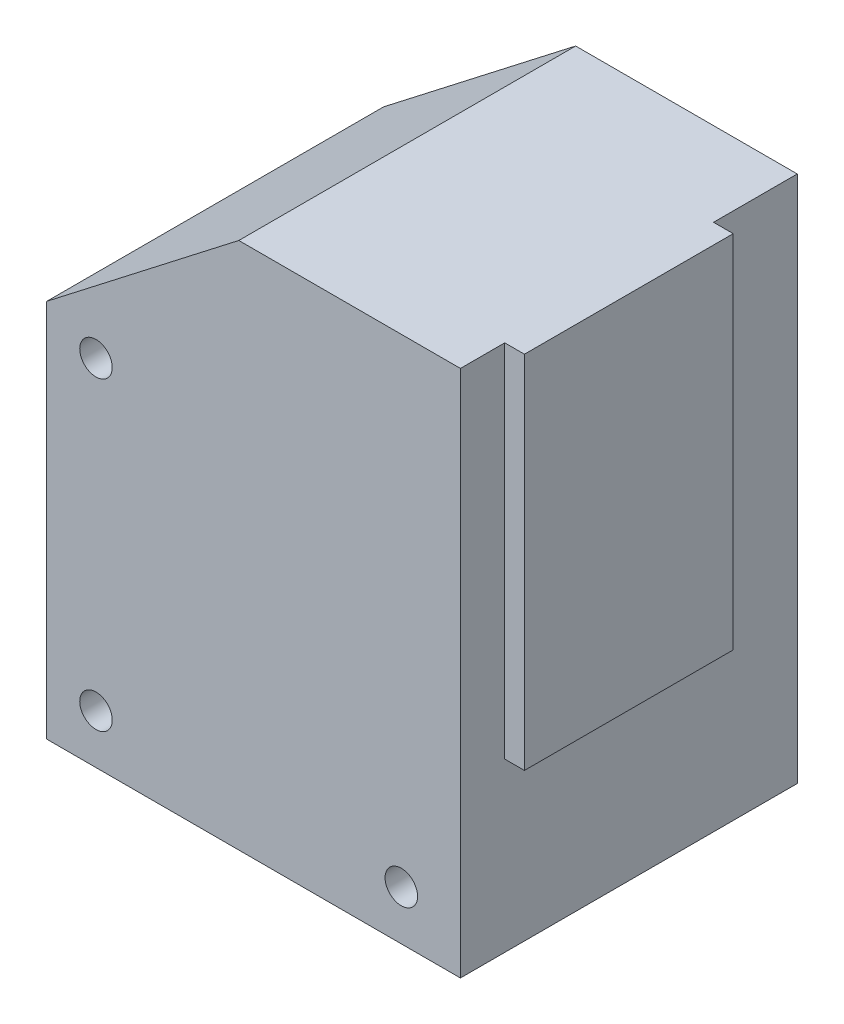
ISO-10303-21;
HEADER;
FILE_DESCRIPTION(('STEP AP214'),'2;1');
FILE_NAME('part.step','',(''),(''),'','','');
FILE_SCHEMA(('AUTOMOTIVE_DESIGN { 1 0 10303 214 1 1 1 1 }'));
ENDSEC;
DATA;
#1=APPLICATION_CONTEXT('core data for automotive mechanical design processes');
#2=APPLICATION_PROTOCOL_DEFINITION('international standard','automotive_design',2000,#1);
#3=PRODUCT_CONTEXT('',#1,'mechanical');
#4=PRODUCT('Part','Part','',(#3));
#5=PRODUCT_RELATED_PRODUCT_CATEGORY('part','',(#4));
#6=PRODUCT_DEFINITION_FORMATION('','',#4);
#7=PRODUCT_DEFINITION_CONTEXT('part definition',#1,'design');
#8=PRODUCT_DEFINITION('design','',#6,#7);
#9=PRODUCT_DEFINITION_SHAPE('','',#8);
#10=(LENGTH_UNIT() NAMED_UNIT(*) SI_UNIT(.MILLI.,.METRE.));
#11=(NAMED_UNIT(*) PLANE_ANGLE_UNIT() SI_UNIT($,.RADIAN.));
#12=(NAMED_UNIT(*) SI_UNIT($,.STERADIAN.) SOLID_ANGLE_UNIT());
#13=UNCERTAINTY_MEASURE_WITH_UNIT(LENGTH_MEASURE(1.E-05),#10,'distance_accuracy_value','');
#14=(GEOMETRIC_REPRESENTATION_CONTEXT(3) GLOBAL_UNCERTAINTY_ASSIGNED_CONTEXT((#13)) GLOBAL_UNIT_ASSIGNED_CONTEXT((#10,
#11,#12)) REPRESENTATION_CONTEXT('',''));
#15=CARTESIAN_POINT('',(0.,0.,0.));
#16=DIRECTION('',(0.,0.,1.));
#17=DIRECTION('',(1.,0.,0.));
#18=AXIS2_PLACEMENT_3D('',#15,#16,#17);
#19=CARTESIAN_POINT('',(42.,0.,34.2));
#20=DIRECTION('',(-1.,0.,0.));
#21=DIRECTION('',(0.,0.,1.));
#22=AXIS2_PLACEMENT_3D('',#19,#20,#21);
#23=PLANE('',#22);
#24=DIRECTION('',(0.,-1.,0.));
#25=VECTOR('',#24,1.);
#26=CARTESIAN_POINT('',(42.,53.6,29.7));
#27=LINE('',#26,#25);
#28=CARTESIAN_POINT('',(42.,53.6,29.7));
#29=VERTEX_POINT('',#28);
#30=CARTESIAN_POINT('',(42.,17.,29.7));
#31=VERTEX_POINT('',#30);
#32=EDGE_CURVE('E134',#29,#31,#27,.T.);
#33=ORIENTED_EDGE('',*,*,#32,.F.);
#34=DIRECTION('',(0.,0.,-1.));
#35=VECTOR('',#34,1.);
#36=CARTESIAN_POINT('',(42.,53.6,34.2));
#37=LINE('',#36,#35);
#38=CARTESIAN_POINT('',(42.,53.6,34.2));
#39=VERTEX_POINT('',#38);
#40=EDGE_CURVE('E190',#39,#29,#37,.T.);
#41=ORIENTED_EDGE('',*,*,#40,.F.);
#42=DIRECTION('',(0.,1.,0.));
#43=VECTOR('',#42,1.);
#44=CARTESIAN_POINT('',(42.,0.,34.2));
#45=LINE('',#44,#43);
#46=CARTESIAN_POINT('',(42.,0.,34.2));
#47=VERTEX_POINT('',#46);
#48=EDGE_CURVE('E159',#47,#39,#45,.T.);
#49=ORIENTED_EDGE('',*,*,#48,.F.);
#50=DIRECTION('',(0.,0.,-1.));
#51=VECTOR('',#50,1.);
#52=CARTESIAN_POINT('',(42.,0.,34.2));
#53=LINE('',#52,#51);
#54=CARTESIAN_POINT('',(42.,0.,0.));
#55=VERTEX_POINT('',#54);
#56=EDGE_CURVE('E48',#47,#55,#53,.T.);
#57=ORIENTED_EDGE('',*,*,#56,.T.);
#58=DIRECTION('',(0.,1.,0.));
#59=VECTOR('',#58,1.);
#60=CARTESIAN_POINT('',(42.,0.,0.));
#61=LINE('',#60,#59);
#62=CARTESIAN_POINT('',(42.,53.6,0.));
#63=VERTEX_POINT('',#62);
#64=EDGE_CURVE('E175',#55,#63,#61,.T.);
#65=ORIENTED_EDGE('',*,*,#64,.T.);
#66=CARTESIAN_POINT('',(42.,53.6,8.5));
#67=VERTEX_POINT('',#66);
#68=EDGE_CURVE('E61',#67,#63,#37,.T.);
#69=ORIENTED_EDGE('',*,*,#68,.F.);
#70=DIRECTION('',(0.,1.,0.));
#71=VECTOR('',#70,1.);
#72=CARTESIAN_POINT('',(42.,53.6,8.5));
#73=LINE('',#72,#71);
#74=CARTESIAN_POINT('',(42.,17.,8.5));
#75=VERTEX_POINT('',#74);
#76=EDGE_CURVE('E131',#75,#67,#73,.T.);
#77=ORIENTED_EDGE('',*,*,#76,.F.);
#78=DIRECTION('',(0.,0.,-1.));
#79=VECTOR('',#78,1.);
#80=CARTESIAN_POINT('',(42.,17.,29.7));
#81=LINE('',#80,#79);
#82=EDGE_CURVE('E55',#31,#75,#81,.T.);
#83=ORIENTED_EDGE('',*,*,#82,.F.);
#84=EDGE_LOOP('',(#33,#41,#49,#57,#65,#69,#77,#83));
#85=FACE_BOUND('',#84,.T.);
#86=ADVANCED_FACE('F39',(#85),#23,.F.);
#87=CARTESIAN_POINT('',(0.,0.,34.2));
#88=DIRECTION('',(1.,0.,0.));
#89=DIRECTION('',(0.,0.,-1.));
#90=AXIS2_PLACEMENT_3D('',#87,#88,#89);
#91=PLANE('',#90);
#92=DIRECTION('',(0.,-1.,0.));
#93=VECTOR('',#92,1.);
#94=CARTESIAN_POINT('',(0.,0.,0.));
#95=LINE('',#94,#93);
#96=CARTESIAN_POINT('',(0.,38.5,0.));
#97=VERTEX_POINT('',#96);
#98=CARTESIAN_POINT('',(0.,0.,0.));
#99=VERTEX_POINT('',#98);
#100=EDGE_CURVE('E149',#97,#99,#95,.T.);
#101=ORIENTED_EDGE('',*,*,#100,.T.);
#102=DIRECTION('',(0.,0.,-1.));
#103=VECTOR('',#102,1.);
#104=CARTESIAN_POINT('',(0.,0.,34.2));
#105=LINE('',#104,#103);
#106=CARTESIAN_POINT('',(0.,0.,34.2));
#107=VERTEX_POINT('',#106);
#108=EDGE_CURVE('E11',#107,#99,#105,.T.);
#109=ORIENTED_EDGE('',*,*,#108,.F.);
#110=DIRECTION('',(0.,-1.,0.));
#111=VECTOR('',#110,1.);
#112=CARTESIAN_POINT('',(0.,0.,34.2));
#113=LINE('',#112,#111);
#114=CARTESIAN_POINT('',(0.,38.5,34.2));
#115=VERTEX_POINT('',#114);
#116=EDGE_CURVE('E151',#115,#107,#113,.T.);
#117=ORIENTED_EDGE('',*,*,#116,.F.);
#118=DIRECTION('',(0.,0.,-1.));
#119=VECTOR('',#118,1.);
#120=CARTESIAN_POINT('',(0.,38.5,34.2));
#121=LINE('',#120,#119);
#122=EDGE_CURVE('E168',#115,#97,#121,.T.);
#123=ORIENTED_EDGE('',*,*,#122,.T.);
#124=EDGE_LOOP('',(#101,#109,#117,#123));
#125=FACE_BOUND('',#124,.T.);
#126=ADVANCED_FACE('F41',(#125),#91,.F.);
#127=CARTESIAN_POINT('',(0.,0.,34.2));
#128=DIRECTION('',(0.,1.,0.));
#129=DIRECTION('',(0.,0.,1.));
#130=AXIS2_PLACEMENT_3D('',#127,#128,#129);
#131=PLANE('',#130);
#132=CARTESIAN_POINT('',(26.,0.,23.7));
#133=DIRECTION('',(0.,-1.,0.));
#134=DIRECTION('',(0.,0.,-1.));
#135=AXIS2_PLACEMENT_3D('',#132,#133,#134);
#136=CIRCLE('',#135,8.);
#137=CARTESIAN_POINT('',(26.,0.,15.7));
#138=VERTEX_POINT('',#137);
#139=EDGE_CURVE('E136',#138,#138,#136,.T.);
#140=ORIENTED_EDGE('',*,*,#139,.F.);
#141=EDGE_LOOP('',(#140));
#142=FACE_BOUND('',#141,.T.);
#143=DIRECTION('',(1.,0.,0.));
#144=VECTOR('',#143,1.);
#145=CARTESIAN_POINT('',(0.,0.,0.));
#146=LINE('',#145,#144);
#147=EDGE_CURVE('E172',#99,#55,#146,.T.);
#148=ORIENTED_EDGE('',*,*,#147,.T.);
#149=ORIENTED_EDGE('',*,*,#56,.F.);
#150=DIRECTION('',(1.,0.,0.));
#151=VECTOR('',#150,1.);
#152=CARTESIAN_POINT('',(0.,0.,34.2));
#153=LINE('',#152,#151);
#154=EDGE_CURVE('E155',#107,#47,#153,.T.);
#155=ORIENTED_EDGE('',*,*,#154,.F.);
#156=ORIENTED_EDGE('',*,*,#108,.T.);
#157=EDGE_LOOP('',(#148,#149,#155,#156));
#158=FACE_BOUND('',#157,.T.);
#159=ADVANCED_FACE('F293',(#142,#158),#131,.F.);
#160=CARTESIAN_POINT('',(19.5,53.6,34.2));
#161=DIRECTION('',(0.,-1.,0.));
#162=DIRECTION('',(0.,0.,-1.));
#163=AXIS2_PLACEMENT_3D('',#160,#161,#162);
#164=PLANE('',#163);
#165=DIRECTION('',(-1.,0.,0.));
#166=VECTOR('',#165,1.);
#167=CARTESIAN_POINT('',(19.5,53.6,0.));
#168=LINE('',#167,#166);
#169=CARTESIAN_POINT('',(19.5,53.6,0.));
#170=VERTEX_POINT('',#169);
#171=EDGE_CURVE('E178',#63,#170,#168,.T.);
#172=ORIENTED_EDGE('',*,*,#171,.T.);
#173=DIRECTION('',(0.,0.,-1.));
#174=VECTOR('',#173,1.);
#175=CARTESIAN_POINT('',(19.5,53.6,34.2));
#176=LINE('',#175,#174);
#177=CARTESIAN_POINT('',(19.5,53.6,34.2));
#178=VERTEX_POINT('',#177);
#179=EDGE_CURVE('E186',#178,#170,#176,.T.);
#180=ORIENTED_EDGE('',*,*,#179,.F.);
#181=DIRECTION('',(-1.,0.,0.));
#182=VECTOR('',#181,1.);
#183=CARTESIAN_POINT('',(19.5,53.6,34.2));
#184=LINE('',#183,#182);
#185=EDGE_CURVE('E162',#39,#178,#184,.T.);
#186=ORIENTED_EDGE('',*,*,#185,.F.);
#187=ORIENTED_EDGE('',*,*,#40,.T.);
#188=DIRECTION('',(-1.,0.,0.));
#189=VECTOR('',#188,1.);
#190=CARTESIAN_POINT('',(44.,53.6,29.7));
#191=LINE('',#190,#189);
#192=CARTESIAN_POINT('',(44.,53.6,29.7));
#193=VERTEX_POINT('',#192);
#194=EDGE_CURVE('E218',#193,#29,#191,.T.);
#195=ORIENTED_EDGE('',*,*,#194,.F.);
#196=DIRECTION('',(0.,0.,1.));
#197=VECTOR('',#196,1.);
#198=CARTESIAN_POINT('',(44.,53.6,29.7));
#199=LINE('',#198,#197);
#200=CARTESIAN_POINT('',(44.,53.6,8.5));
#201=VERTEX_POINT('',#200);
#202=EDGE_CURVE('E126',#201,#193,#199,.T.);
#203=ORIENTED_EDGE('',*,*,#202,.F.);
#204=DIRECTION('',(-1.,0.,0.));
#205=VECTOR('',#204,1.);
#206=CARTESIAN_POINT('',(44.,53.6,8.5));
#207=LINE('',#206,#205);
#208=EDGE_CURVE('E143',#201,#67,#207,.T.);
#209=ORIENTED_EDGE('',*,*,#208,.T.);
#210=ORIENTED_EDGE('',*,*,#68,.T.);
#211=EDGE_LOOP('',(#172,#180,#186,#187,#195,#203,#209,#210));
#212=FACE_BOUND('',#211,.T.);
#213=ADVANCED_FACE('F207',(#212),#164,.F.);
#214=CARTESIAN_POINT('',(0.,38.5,34.2));
#215=DIRECTION('',(0.612254968981374,-0.79066039040641,0.));
#216=DIRECTION('',(0.79066039040641,0.612254968981374,0.));
#217=AXIS2_PLACEMENT_3D('',#214,#215,#216);
#218=PLANE('',#217);
#219=DIRECTION('',(-0.79066039040641,-0.612254968981374,0.));
#220=VECTOR('',#219,1.);
#221=CARTESIAN_POINT('',(0.,38.5,0.));
#222=LINE('',#221,#220);
#223=EDGE_CURVE('E156',#170,#97,#222,.T.);
#224=ORIENTED_EDGE('',*,*,#223,.T.);
#225=ORIENTED_EDGE('',*,*,#122,.F.);
#226=DIRECTION('',(-0.79066039040641,-0.612254968981374,0.));
#227=VECTOR('',#226,1.);
#228=CARTESIAN_POINT('',(0.,38.5,34.2));
#229=LINE('',#228,#227);
#230=EDGE_CURVE('E165',#178,#115,#229,.T.);
#231=ORIENTED_EDGE('',*,*,#230,.F.);
#232=ORIENTED_EDGE('',*,*,#179,.T.);
#233=EDGE_LOOP('',(#224,#225,#231,#232));
#234=FACE_BOUND('',#233,.T.);
#235=ADVANCED_FACE('F212',(#234),#218,.F.);
#236=CARTESIAN_POINT('',(0.,0.,34.2));
#237=DIRECTION('',(0.,0.,-1.));
#238=DIRECTION('',(-1.,0.,0.));
#239=AXIS2_PLACEMENT_3D('',#236,#237,#238);
#240=PLANE('',#239);
#241=CARTESIAN_POINT('',(36.,5.,34.2));
#242=DIRECTION('',(0.,0.,-1.));
#243=DIRECTION('',(-1.,0.,0.));
#244=AXIS2_PLACEMENT_3D('',#241,#242,#243);
#245=CIRCLE('',#244,1.65);
#246=CARTESIAN_POINT('',(34.35,5.,34.2));
#247=VERTEX_POINT('',#246);
#248=EDGE_CURVE('E230',#247,#247,#245,.T.);
#249=ORIENTED_EDGE('',*,*,#248,.T.);
#250=EDGE_LOOP('',(#249));
#251=FACE_BOUND('',#250,.T.);
#252=CARTESIAN_POINT('',(5.,5.,34.2));
#253=DIRECTION('',(0.,0.,-1.));
#254=DIRECTION('',(-1.,0.,0.));
#255=AXIS2_PLACEMENT_3D('',#252,#253,#254);
#256=CIRCLE('',#255,1.65);
#257=CARTESIAN_POINT('',(3.35,5.,34.2));
#258=VERTEX_POINT('',#257);
#259=EDGE_CURVE('E246',#258,#258,#256,.T.);
#260=ORIENTED_EDGE('',*,*,#259,.T.);
#261=EDGE_LOOP('',(#260));
#262=FACE_BOUND('',#261,.T.);
#263=CARTESIAN_POINT('',(5.,36.,34.2));
#264=DIRECTION('',(0.,0.,-1.));
#265=DIRECTION('',(-1.,0.,0.));
#266=AXIS2_PLACEMENT_3D('',#263,#264,#265);
#267=CIRCLE('',#266,1.65);
#268=CARTESIAN_POINT('',(3.35,36.,34.2));
#269=VERTEX_POINT('',#268);
#270=EDGE_CURVE('E238',#269,#269,#267,.T.);
#271=ORIENTED_EDGE('',*,*,#270,.T.);
#272=EDGE_LOOP('',(#271));
#273=FACE_BOUND('',#272,.T.);
#274=ORIENTED_EDGE('',*,*,#116,.T.);
#275=ORIENTED_EDGE('',*,*,#154,.T.);
#276=ORIENTED_EDGE('',*,*,#48,.T.);
#277=ORIENTED_EDGE('',*,*,#185,.T.);
#278=ORIENTED_EDGE('',*,*,#230,.T.);
#279=EDGE_LOOP('',(#274,#275,#276,#277,#278));
#280=FACE_BOUND('',#279,.T.);
#281=ADVANCED_FACE('F216',(#251,#262,#273,#280),#240,.F.);
#282=CARTESIAN_POINT('',(0.,0.,0.));
#283=DIRECTION('',(0.,0.,-1.));
#284=DIRECTION('',(-1.,0.,0.));
#285=AXIS2_PLACEMENT_3D('',#282,#283,#284);
#286=PLANE('',#285);
#287=CARTESIAN_POINT('',(36.,5.,0.));
#288=DIRECTION('',(0.,0.,-1.));
#289=DIRECTION('',(-1.,0.,0.));
#290=AXIS2_PLACEMENT_3D('',#287,#288,#289);
#291=CIRCLE('',#290,1.65);
#292=CARTESIAN_POINT('',(34.35,5.,0.));
#293=VERTEX_POINT('',#292);
#294=EDGE_CURVE('E250',#293,#293,#291,.T.);
#295=ORIENTED_EDGE('',*,*,#294,.F.);
#296=EDGE_LOOP('',(#295));
#297=FACE_BOUND('',#296,.T.);
#298=CARTESIAN_POINT('',(5.,5.,0.));
#299=DIRECTION('',(0.,0.,-1.));
#300=DIRECTION('',(-1.,0.,0.));
#301=AXIS2_PLACEMENT_3D('',#298,#299,#300);
#302=CIRCLE('',#301,1.65);
#303=CARTESIAN_POINT('',(3.35,5.,0.));
#304=VERTEX_POINT('',#303);
#305=EDGE_CURVE('E242',#304,#304,#302,.T.);
#306=ORIENTED_EDGE('',*,*,#305,.F.);
#307=EDGE_LOOP('',(#306));
#308=FACE_BOUND('',#307,.T.);
#309=CARTESIAN_POINT('',(5.,36.,0.));
#310=DIRECTION('',(0.,0.,-1.));
#311=DIRECTION('',(-1.,0.,0.));
#312=AXIS2_PLACEMENT_3D('',#309,#310,#311);
#313=CIRCLE('',#312,1.65);
#314=CARTESIAN_POINT('',(3.35,36.,0.));
#315=VERTEX_POINT('',#314);
#316=EDGE_CURVE('E234',#315,#315,#313,.T.);
#317=ORIENTED_EDGE('',*,*,#316,.F.);
#318=EDGE_LOOP('',(#317));
#319=FACE_BOUND('',#318,.T.);
#320=ORIENTED_EDGE('',*,*,#100,.F.);
#321=ORIENTED_EDGE('',*,*,#223,.F.);
#322=ORIENTED_EDGE('',*,*,#171,.F.);
#323=ORIENTED_EDGE('',*,*,#64,.F.);
#324=ORIENTED_EDGE('',*,*,#147,.F.);
#325=EDGE_LOOP('',(#320,#321,#322,#323,#324));
#326=FACE_BOUND('',#325,.T.);
#327=ADVANCED_FACE('F203',(#297,#308,#319,#326),#286,.T.);
#328=CARTESIAN_POINT('',(26.,10.,23.7));
#329=DIRECTION('',(0.,-1.,0.));
#330=DIRECTION('',(0.,0.,-1.));
#331=AXIS2_PLACEMENT_3D('',#328,#329,#330);
#332=CYLINDRICAL_SURFACE('',#331,8.);
#333=CARTESIAN_POINT('',(26.,10.,23.7));
#334=DIRECTION('',(0.,-1.,0.));
#335=DIRECTION('',(0.,0.,-1.));
#336=AXIS2_PLACEMENT_3D('',#333,#334,#335);
#337=CIRCLE('',#336,8.);
#338=CARTESIAN_POINT('',(26.,10.,15.7));
#339=VERTEX_POINT('',#338);
#340=EDGE_CURVE('E141',#339,#339,#337,.T.);
#341=ORIENTED_EDGE('',*,*,#340,.F.);
#342=EDGE_LOOP('',(#341));
#343=FACE_BOUND('',#342,.T.);
#344=ORIENTED_EDGE('',*,*,#139,.T.);
#345=EDGE_LOOP('',(#344));
#346=FACE_BOUND('',#345,.T.);
#347=ADVANCED_FACE('F269',(#343,#346),#332,.F.);
#348=CARTESIAN_POINT('',(26.,10.,23.7));
#349=DIRECTION('',(0.,-1.,0.));
#350=DIRECTION('',(0.,0.,-1.));
#351=AXIS2_PLACEMENT_3D('',#348,#349,#350);
#352=PLANE('',#351);
#353=ORIENTED_EDGE('',*,*,#340,.T.);
#354=EDGE_LOOP('',(#353));
#355=FACE_BOUND('',#354,.T.);
#356=ADVANCED_FACE('F305',(#355),#352,.T.);
#357=CARTESIAN_POINT('',(44.,53.6,29.7));
#358=DIRECTION('',(0.,0.,-1.));
#359=DIRECTION('',(0.,1.,0.));
#360=AXIS2_PLACEMENT_3D('',#357,#358,#359);
#361=PLANE('',#360);
#362=ORIENTED_EDGE('',*,*,#32,.T.);
#363=DIRECTION('',(-1.,0.,0.));
#364=VECTOR('',#363,1.);
#365=CARTESIAN_POINT('',(44.,17.,29.7));
#366=LINE('',#365,#364);
#367=CARTESIAN_POINT('',(44.,17.,29.7));
#368=VERTEX_POINT('',#367);
#369=EDGE_CURVE('E113',#368,#31,#366,.T.);
#370=ORIENTED_EDGE('',*,*,#369,.F.);
#371=DIRECTION('',(0.,-1.,0.));
#372=VECTOR('',#371,1.);
#373=CARTESIAN_POINT('',(44.,53.6,29.7));
#374=LINE('',#373,#372);
#375=EDGE_CURVE('E121',#193,#368,#374,.T.);
#376=ORIENTED_EDGE('',*,*,#375,.F.);
#377=ORIENTED_EDGE('',*,*,#194,.T.);
#378=EDGE_LOOP('',(#362,#370,#376,#377));
#379=FACE_BOUND('',#378,.T.);
#380=ADVANCED_FACE('F133',(#379),#361,.F.);
#381=CARTESIAN_POINT('',(44.,17.,29.7));
#382=DIRECTION('',(0.,1.,0.));
#383=DIRECTION('',(0.,0.,1.));
#384=AXIS2_PLACEMENT_3D('',#381,#382,#383);
#385=PLANE('',#384);
#386=ORIENTED_EDGE('',*,*,#82,.T.);
#387=DIRECTION('',(-1.,0.,0.));
#388=VECTOR('',#387,1.);
#389=CARTESIAN_POINT('',(44.,17.,8.5));
#390=LINE('',#389,#388);
#391=CARTESIAN_POINT('',(44.,17.,8.5));
#392=VERTEX_POINT('',#391);
#393=EDGE_CURVE('E116',#392,#75,#390,.T.);
#394=ORIENTED_EDGE('',*,*,#393,.F.);
#395=DIRECTION('',(0.,0.,-1.));
#396=VECTOR('',#395,1.);
#397=CARTESIAN_POINT('',(44.,17.,29.7));
#398=LINE('',#397,#396);
#399=EDGE_CURVE('E109',#368,#392,#398,.T.);
#400=ORIENTED_EDGE('',*,*,#399,.F.);
#401=ORIENTED_EDGE('',*,*,#369,.T.);
#402=EDGE_LOOP('',(#386,#394,#400,#401));
#403=FACE_BOUND('',#402,.T.);
#404=ADVANCED_FACE('F111',(#403),#385,.F.);
#405=CARTESIAN_POINT('',(44.,53.6,8.5));
#406=DIRECTION('',(0.,0.,1.));
#407=DIRECTION('',(0.,-1.,0.));
#408=AXIS2_PLACEMENT_3D('',#405,#406,#407);
#409=PLANE('',#408);
#410=ORIENTED_EDGE('',*,*,#76,.T.);
#411=ORIENTED_EDGE('',*,*,#208,.F.);
#412=DIRECTION('',(0.,1.,0.));
#413=VECTOR('',#412,1.);
#414=CARTESIAN_POINT('',(44.,53.6,8.5));
#415=LINE('',#414,#413);
#416=EDGE_CURVE('E120',#392,#201,#415,.T.);
#417=ORIENTED_EDGE('',*,*,#416,.F.);
#418=ORIENTED_EDGE('',*,*,#393,.T.);
#419=EDGE_LOOP('',(#410,#411,#417,#418));
#420=FACE_BOUND('',#419,.T.);
#421=ADVANCED_FACE('F285',(#420),#409,.F.);
#422=CARTESIAN_POINT('',(44.,0.,0.));
#423=DIRECTION('',(1.,0.,0.));
#424=DIRECTION('',(0.,0.,-1.));
#425=AXIS2_PLACEMENT_3D('',#422,#423,#424);
#426=PLANE('',#425);
#427=ORIENTED_EDGE('',*,*,#375,.T.);
#428=ORIENTED_EDGE('',*,*,#399,.T.);
#429=ORIENTED_EDGE('',*,*,#416,.T.);
#430=ORIENTED_EDGE('',*,*,#202,.T.);
#431=EDGE_LOOP('',(#427,#428,#429,#430));
#432=FACE_BOUND('',#431,.T.);
#433=ADVANCED_FACE('F124',(#432),#426,.T.);
#434=CARTESIAN_POINT('',(5.,36.,34.2));
#435=DIRECTION('',(0.,0.,-1.));
#436=DIRECTION('',(-1.,0.,0.));
#437=AXIS2_PLACEMENT_3D('',#434,#435,#436);
#438=CYLINDRICAL_SURFACE('',#437,1.65);
#439=ORIENTED_EDGE('',*,*,#270,.F.);
#440=EDGE_LOOP('',(#439));
#441=FACE_BOUND('',#440,.T.);
#442=ORIENTED_EDGE('',*,*,#316,.T.);
#443=EDGE_LOOP('',(#442));
#444=FACE_BOUND('',#443,.T.);
#445=ADVANCED_FACE('F275',(#441,#444),#438,.F.);
#446=CARTESIAN_POINT('',(5.,5.,34.2));
#447=DIRECTION('',(0.,0.,-1.));
#448=DIRECTION('',(-1.,0.,0.));
#449=AXIS2_PLACEMENT_3D('',#446,#447,#448);
#450=CYLINDRICAL_SURFACE('',#449,1.65);
#451=ORIENTED_EDGE('',*,*,#259,.F.);
#452=EDGE_LOOP('',(#451));
#453=FACE_BOUND('',#452,.T.);
#454=ORIENTED_EDGE('',*,*,#305,.T.);
#455=EDGE_LOOP('',(#454));
#456=FACE_BOUND('',#455,.T.);
#457=ADVANCED_FACE('F263',(#453,#456),#450,.F.);
#458=CARTESIAN_POINT('',(36.,5.,34.2));
#459=DIRECTION('',(0.,0.,-1.));
#460=DIRECTION('',(-1.,0.,0.));
#461=AXIS2_PLACEMENT_3D('',#458,#459,#460);
#462=CYLINDRICAL_SURFACE('',#461,1.65);
#463=ORIENTED_EDGE('',*,*,#248,.F.);
#464=EDGE_LOOP('',(#463));
#465=FACE_BOUND('',#464,.T.);
#466=ORIENTED_EDGE('',*,*,#294,.T.);
#467=EDGE_LOOP('',(#466));
#468=FACE_BOUND('',#467,.T.);
#469=ADVANCED_FACE('F260',(#465,#468),#462,.F.);
#470=CLOSED_SHELL('',(#86,#126,#159,#213,#235,#281,#327,#347,#356,#380,#404,#421,#433,#445,#457,#469));
#471=MANIFOLD_SOLID_BREP('B2',#470);
#472=ADVANCED_BREP_SHAPE_REPRESENTATION('',(#18,#471),#14);
#473=SHAPE_DEFINITION_REPRESENTATION(#9,#472);
ENDSEC;
END-ISO-10303-21;
